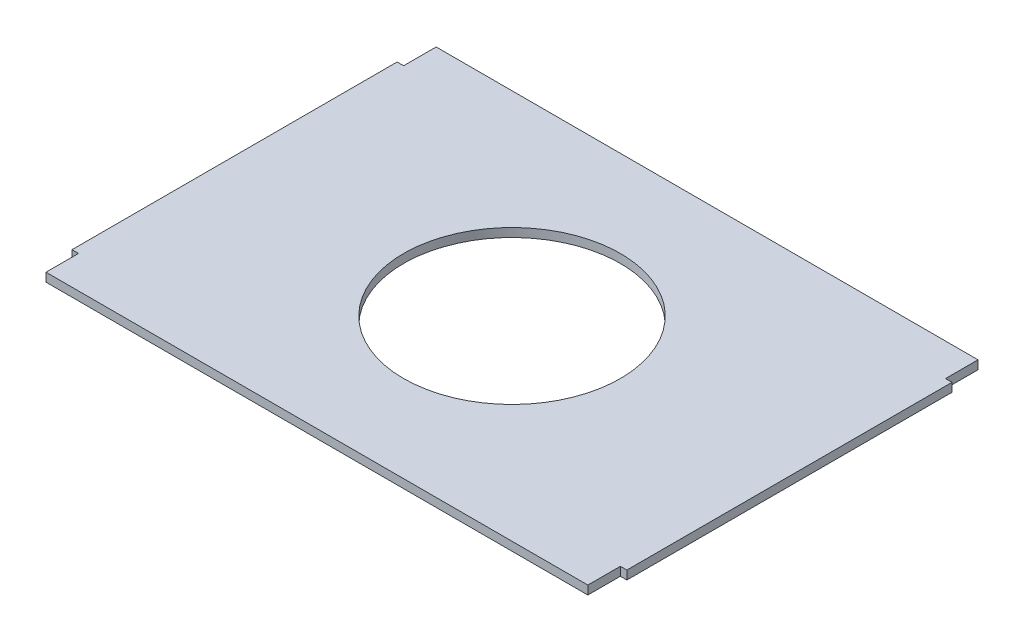
ISO-10303-21;
HEADER;
FILE_DESCRIPTION(('STEP AP214'),'2;1');
FILE_NAME('part.step','',(''),(''),'','','');
FILE_SCHEMA(('AUTOMOTIVE_DESIGN { 1 0 10303 214 1 1 1 1 }'));
ENDSEC;
DATA;
#1=APPLICATION_CONTEXT('core data for automotive mechanical design processes');
#2=APPLICATION_PROTOCOL_DEFINITION('international standard','automotive_design',2000,#1);
#3=PRODUCT_CONTEXT('',#1,'mechanical');
#4=PRODUCT('Part','Part','',(#3));
#5=PRODUCT_RELATED_PRODUCT_CATEGORY('part','',(#4));
#6=PRODUCT_DEFINITION_FORMATION('','',#4);
#7=PRODUCT_DEFINITION_CONTEXT('part definition',#1,'design');
#8=PRODUCT_DEFINITION('design','',#6,#7);
#9=PRODUCT_DEFINITION_SHAPE('','',#8);
#10=(LENGTH_UNIT() NAMED_UNIT(*) SI_UNIT(.MILLI.,.METRE.));
#11=(NAMED_UNIT(*) PLANE_ANGLE_UNIT() SI_UNIT($,.RADIAN.));
#12=(NAMED_UNIT(*) SI_UNIT($,.STERADIAN.) SOLID_ANGLE_UNIT());
#13=UNCERTAINTY_MEASURE_WITH_UNIT(LENGTH_MEASURE(1.E-05),#10,'distance_accuracy_value','');
#14=(GEOMETRIC_REPRESENTATION_CONTEXT(3) GLOBAL_UNCERTAINTY_ASSIGNED_CONTEXT((#13)) GLOBAL_UNIT_ASSIGNED_CONTEXT((#10,
#11,#12)) REPRESENTATION_CONTEXT('',''));
#15=CARTESIAN_POINT('',(0.,0.,0.));
#16=DIRECTION('',(0.,0.,1.));
#17=DIRECTION('',(1.,0.,0.));
#18=AXIS2_PLACEMENT_3D('',#15,#16,#17);
#19=CARTESIAN_POINT('',(0.,4.,0.));
#20=DIRECTION('',(0.,-1.,0.));
#21=DIRECTION('',(0.,0.,-1.));
#22=AXIS2_PLACEMENT_3D('',#19,#20,#21);
#23=PLANE('',#22);
#24=DIRECTION('',(0.,0.,-1.));
#25=VECTOR('',#24,1.);
#26=CARTESIAN_POINT('',(125.,4.,-75.));
#27=LINE('',#26,#25);
#28=CARTESIAN_POINT('',(125.,4.,-75.));
#29=VERTEX_POINT('',#28);
#30=CARTESIAN_POINT('',(125.,4.,-90.));
#31=VERTEX_POINT('',#30);
#32=EDGE_CURVE('E179',#29,#31,#27,.T.);
#33=ORIENTED_EDGE('',*,*,#32,.T.);
#34=DIRECTION('',(-1.,0.,0.));
#35=VECTOR('',#34,1.);
#36=CARTESIAN_POINT('',(-125.,4.,-90.));
#37=LINE('',#36,#35);
#38=CARTESIAN_POINT('',(-125.,4.,-90.));
#39=VERTEX_POINT('',#38);
#40=EDGE_CURVE('E107',#31,#39,#37,.T.);
#41=ORIENTED_EDGE('',*,*,#40,.T.);
#42=DIRECTION('',(0.,0.,1.));
#43=VECTOR('',#42,1.);
#44=CARTESIAN_POINT('',(-125.,4.,-75.));
#45=LINE('',#44,#43);
#46=CARTESIAN_POINT('',(-125.,4.,-75.));
#47=VERTEX_POINT('',#46);
#48=EDGE_CURVE('E206',#39,#47,#45,.T.);
#49=ORIENTED_EDGE('',*,*,#48,.T.);
#50=DIRECTION('',(-1.,0.,0.));
#51=VECTOR('',#50,1.);
#52=CARTESIAN_POINT('',(-128.,4.,-75.));
#53=LINE('',#52,#51);
#54=CARTESIAN_POINT('',(-128.,4.,-75.));
#55=VERTEX_POINT('',#54);
#56=EDGE_CURVE('E225',#47,#55,#53,.T.);
#57=ORIENTED_EDGE('',*,*,#56,.T.);
#58=DIRECTION('',(0.,0.,1.));
#59=VECTOR('',#58,1.);
#60=CARTESIAN_POINT('',(-128.,4.,75.));
#61=LINE('',#60,#59);
#62=CARTESIAN_POINT('',(-128.,4.,75.));
#63=VERTEX_POINT('',#62);
#64=EDGE_CURVE('E222',#55,#63,#61,.T.);
#65=ORIENTED_EDGE('',*,*,#64,.T.);
#66=DIRECTION('',(1.,0.,0.));
#67=VECTOR('',#66,1.);
#68=CARTESIAN_POINT('',(-128.,4.,75.));
#69=LINE('',#68,#67);
#70=CARTESIAN_POINT('',(-125.,4.,75.));
#71=VERTEX_POINT('',#70);
#72=EDGE_CURVE('E224',#63,#71,#69,.T.);
#73=ORIENTED_EDGE('',*,*,#72,.T.);
#74=DIRECTION('',(0.,0.,1.));
#75=VECTOR('',#74,1.);
#76=CARTESIAN_POINT('',(-125.,4.,90.));
#77=LINE('',#76,#75);
#78=CARTESIAN_POINT('',(-125.,4.,90.));
#79=VERTEX_POINT('',#78);
#80=EDGE_CURVE('E227',#71,#79,#77,.T.);
#81=ORIENTED_EDGE('',*,*,#80,.T.);
#82=DIRECTION('',(1.,0.,0.));
#83=VECTOR('',#82,1.);
#84=CARTESIAN_POINT('',(-125.,4.,90.));
#85=LINE('',#84,#83);
#86=CARTESIAN_POINT('',(125.,4.,90.));
#87=VERTEX_POINT('',#86);
#88=EDGE_CURVE('E233',#79,#87,#85,.T.);
#89=ORIENTED_EDGE('',*,*,#88,.T.);
#90=DIRECTION('',(0.,0.,-1.));
#91=VECTOR('',#90,1.);
#92=CARTESIAN_POINT('',(125.,4.,90.));
#93=LINE('',#92,#91);
#94=CARTESIAN_POINT('',(125.,4.,75.));
#95=VERTEX_POINT('',#94);
#96=EDGE_CURVE('E138',#87,#95,#93,.T.);
#97=ORIENTED_EDGE('',*,*,#96,.T.);
#98=DIRECTION('',(1.,0.,0.));
#99=VECTOR('',#98,1.);
#100=CARTESIAN_POINT('',(125.,4.,75.));
#101=LINE('',#100,#99);
#102=CARTESIAN_POINT('',(128.,4.,75.));
#103=VERTEX_POINT('',#102);
#104=EDGE_CURVE('E132',#95,#103,#101,.T.);
#105=ORIENTED_EDGE('',*,*,#104,.T.);
#106=DIRECTION('',(0.,0.,-1.));
#107=VECTOR('',#106,1.);
#108=CARTESIAN_POINT('',(128.,4.,75.));
#109=LINE('',#108,#107);
#110=CARTESIAN_POINT('',(128.,4.,-75.));
#111=VERTEX_POINT('',#110);
#112=EDGE_CURVE('E136',#103,#111,#109,.T.);
#113=ORIENTED_EDGE('',*,*,#112,.T.);
#114=DIRECTION('',(-1.,0.,0.));
#115=VECTOR('',#114,1.);
#116=CARTESIAN_POINT('',(125.,4.,-75.));
#117=LINE('',#116,#115);
#118=EDGE_CURVE('E52',#111,#29,#117,.T.);
#119=ORIENTED_EDGE('',*,*,#118,.T.);
#120=EDGE_LOOP('',(#33,#41,#49,#57,#65,#73,#81,#89,#97,#105,#113,#119));
#121=FACE_BOUND('',#120,.T.);
#122=CARTESIAN_POINT('',(0.,4.,0.));
#123=DIRECTION('',(0.,1.,0.));
#124=DIRECTION('',(0.,0.,1.));
#125=AXIS2_PLACEMENT_3D('',#122,#123,#124);
#126=CIRCLE('',#125,50.);
#127=CARTESIAN_POINT('',(0.,4.,50.));
#128=VERTEX_POINT('',#127);
#129=EDGE_CURVE('E160',#128,#128,#126,.T.);
#130=ORIENTED_EDGE('',*,*,#129,.F.);
#131=EDGE_LOOP('',(#130));
#132=FACE_BOUND('',#131,.T.);
#133=ADVANCED_FACE('F35',(#121,#132),#23,.F.);
#134=CARTESIAN_POINT('',(0.,0.,0.));
#135=DIRECTION('',(0.,-1.,0.));
#136=DIRECTION('',(0.,0.,-1.));
#137=AXIS2_PLACEMENT_3D('',#134,#135,#136);
#138=PLANE('',#137);
#139=DIRECTION('',(0.,0.,-1.));
#140=VECTOR('',#139,1.);
#141=CARTESIAN_POINT('',(125.,0.,-75.));
#142=LINE('',#141,#140);
#143=CARTESIAN_POINT('',(125.,0.,-75.));
#144=VERTEX_POINT('',#143);
#145=CARTESIAN_POINT('',(125.,0.,-90.));
#146=VERTEX_POINT('',#145);
#147=EDGE_CURVE('E156',#144,#146,#142,.T.);
#148=ORIENTED_EDGE('',*,*,#147,.F.);
#149=DIRECTION('',(-1.,0.,0.));
#150=VECTOR('',#149,1.);
#151=CARTESIAN_POINT('',(125.,0.,-75.));
#152=LINE('',#151,#150);
#153=CARTESIAN_POINT('',(128.,0.,-75.));
#154=VERTEX_POINT('',#153);
#155=EDGE_CURVE('E99',#154,#144,#152,.T.);
#156=ORIENTED_EDGE('',*,*,#155,.F.);
#157=DIRECTION('',(0.,0.,-1.));
#158=VECTOR('',#157,1.);
#159=CARTESIAN_POINT('',(128.,0.,75.));
#160=LINE('',#159,#158);
#161=CARTESIAN_POINT('',(128.,0.,75.));
#162=VERTEX_POINT('',#161);
#163=EDGE_CURVE('E93',#162,#154,#160,.T.);
#164=ORIENTED_EDGE('',*,*,#163,.F.);
#165=DIRECTION('',(1.,0.,0.));
#166=VECTOR('',#165,1.);
#167=CARTESIAN_POINT('',(125.,0.,75.));
#168=LINE('',#167,#166);
#169=CARTESIAN_POINT('',(125.,0.,75.));
#170=VERTEX_POINT('',#169);
#171=EDGE_CURVE('E146',#170,#162,#168,.T.);
#172=ORIENTED_EDGE('',*,*,#171,.F.);
#173=DIRECTION('',(0.,0.,-1.));
#174=VECTOR('',#173,1.);
#175=CARTESIAN_POINT('',(125.,0.,90.));
#176=LINE('',#175,#174);
#177=CARTESIAN_POINT('',(125.,0.,90.));
#178=VERTEX_POINT('',#177);
#179=EDGE_CURVE('E174',#178,#170,#176,.T.);
#180=ORIENTED_EDGE('',*,*,#179,.F.);
#181=DIRECTION('',(1.,0.,0.));
#182=VECTOR('',#181,1.);
#183=CARTESIAN_POINT('',(-125.,0.,90.));
#184=LINE('',#183,#182);
#185=CARTESIAN_POINT('',(-125.,0.,90.));
#186=VERTEX_POINT('',#185);
#187=EDGE_CURVE('E172',#186,#178,#184,.T.);
#188=ORIENTED_EDGE('',*,*,#187,.F.);
#189=DIRECTION('',(0.,0.,1.));
#190=VECTOR('',#189,1.);
#191=CARTESIAN_POINT('',(-125.,0.,90.));
#192=LINE('',#191,#190);
#193=CARTESIAN_POINT('',(-125.,0.,75.));
#194=VERTEX_POINT('',#193);
#195=EDGE_CURVE('E170',#194,#186,#192,.T.);
#196=ORIENTED_EDGE('',*,*,#195,.F.);
#197=DIRECTION('',(1.,0.,0.));
#198=VECTOR('',#197,1.);
#199=CARTESIAN_POINT('',(-128.,0.,75.));
#200=LINE('',#199,#198);
#201=CARTESIAN_POINT('',(-128.,0.,75.));
#202=VERTEX_POINT('',#201);
#203=EDGE_CURVE('E168',#202,#194,#200,.T.);
#204=ORIENTED_EDGE('',*,*,#203,.F.);
#205=DIRECTION('',(0.,0.,1.));
#206=VECTOR('',#205,1.);
#207=CARTESIAN_POINT('',(-128.,0.,75.));
#208=LINE('',#207,#206);
#209=CARTESIAN_POINT('',(-128.,0.,-75.));
#210=VERTEX_POINT('',#209);
#211=EDGE_CURVE('E166',#210,#202,#208,.T.);
#212=ORIENTED_EDGE('',*,*,#211,.F.);
#213=DIRECTION('',(-1.,0.,0.));
#214=VECTOR('',#213,1.);
#215=CARTESIAN_POINT('',(-128.,0.,-75.));
#216=LINE('',#215,#214);
#217=CARTESIAN_POINT('',(-125.,0.,-75.));
#218=VERTEX_POINT('',#217);
#219=EDGE_CURVE('E164',#218,#210,#216,.T.);
#220=ORIENTED_EDGE('',*,*,#219,.F.);
#221=DIRECTION('',(0.,0.,1.));
#222=VECTOR('',#221,1.);
#223=CARTESIAN_POINT('',(-125.,0.,-75.));
#224=LINE('',#223,#222);
#225=CARTESIAN_POINT('',(-125.,0.,-90.));
#226=VERTEX_POINT('',#225);
#227=EDGE_CURVE('E162',#226,#218,#224,.T.);
#228=ORIENTED_EDGE('',*,*,#227,.F.);
#229=DIRECTION('',(-1.,0.,0.));
#230=VECTOR('',#229,1.);
#231=CARTESIAN_POINT('',(-125.,0.,-90.));
#232=LINE('',#231,#230);
#233=EDGE_CURVE('E159',#146,#226,#232,.T.);
#234=ORIENTED_EDGE('',*,*,#233,.F.);
#235=EDGE_LOOP('',(#148,#156,#164,#172,#180,#188,#196,#204,#212,#220,#228,#234));
#236=FACE_BOUND('',#235,.T.);
#237=CARTESIAN_POINT('',(0.,0.,0.));
#238=DIRECTION('',(0.,1.,0.));
#239=DIRECTION('',(0.,0.,1.));
#240=AXIS2_PLACEMENT_3D('',#237,#238,#239);
#241=CIRCLE('',#240,50.);
#242=CARTESIAN_POINT('',(0.,0.,50.));
#243=VERTEX_POINT('',#242);
#244=EDGE_CURVE('E380',#243,#243,#241,.T.);
#245=ORIENTED_EDGE('',*,*,#244,.T.);
#246=EDGE_LOOP('',(#245));
#247=FACE_BOUND('',#246,.T.);
#248=ADVANCED_FACE('F210',(#236,#247),#138,.T.);
#249=CARTESIAN_POINT('',(125.,4.,-75.));
#250=DIRECTION('',(-1.,0.,0.));
#251=DIRECTION('',(0.,0.,1.));
#252=AXIS2_PLACEMENT_3D('',#249,#250,#251);
#253=PLANE('',#252);
#254=ORIENTED_EDGE('',*,*,#147,.T.);
#255=DIRECTION('',(0.,-1.,0.));
#256=VECTOR('',#255,1.);
#257=CARTESIAN_POINT('',(125.,4.,-90.));
#258=LINE('',#257,#256);
#259=EDGE_CURVE('E11',#31,#146,#258,.T.);
#260=ORIENTED_EDGE('',*,*,#259,.F.);
#261=ORIENTED_EDGE('',*,*,#32,.F.);
#262=DIRECTION('',(0.,-1.,0.));
#263=VECTOR('',#262,1.);
#264=CARTESIAN_POINT('',(125.,4.,-75.));
#265=LINE('',#264,#263);
#266=EDGE_CURVE('E152',#29,#144,#265,.T.);
#267=ORIENTED_EDGE('',*,*,#266,.T.);
#268=EDGE_LOOP('',(#254,#260,#261,#267));
#269=FACE_BOUND('',#268,.T.);
#270=ADVANCED_FACE('F37',(#269),#253,.F.);
#271=CARTESIAN_POINT('',(-125.,4.,-90.));
#272=DIRECTION('',(0.,0.,1.));
#273=DIRECTION('',(1.,0.,0.));
#274=AXIS2_PLACEMENT_3D('',#271,#272,#273);
#275=PLANE('',#274);
#276=ORIENTED_EDGE('',*,*,#233,.T.);
#277=DIRECTION('',(0.,-1.,0.));
#278=VECTOR('',#277,1.);
#279=CARTESIAN_POINT('',(-125.,4.,-90.));
#280=LINE('',#279,#278);
#281=EDGE_CURVE('E44',#39,#226,#280,.T.);
#282=ORIENTED_EDGE('',*,*,#281,.F.);
#283=ORIENTED_EDGE('',*,*,#40,.F.);
#284=ORIENTED_EDGE('',*,*,#259,.T.);
#285=EDGE_LOOP('',(#276,#282,#283,#284));
#286=FACE_BOUND('',#285,.T.);
#287=ADVANCED_FACE('F267',(#286),#275,.F.);
#288=CARTESIAN_POINT('',(-125.,4.,-75.));
#289=DIRECTION('',(1.,0.,0.));
#290=DIRECTION('',(0.,0.,-1.));
#291=AXIS2_PLACEMENT_3D('',#288,#289,#290);
#292=PLANE('',#291);
#293=ORIENTED_EDGE('',*,*,#227,.T.);
#294=DIRECTION('',(0.,-1.,0.));
#295=VECTOR('',#294,1.);
#296=CARTESIAN_POINT('',(-125.,4.,-75.));
#297=LINE('',#296,#295);
#298=EDGE_CURVE('E198',#47,#218,#297,.T.);
#299=ORIENTED_EDGE('',*,*,#298,.F.);
#300=ORIENTED_EDGE('',*,*,#48,.F.);
#301=ORIENTED_EDGE('',*,*,#281,.T.);
#302=EDGE_LOOP('',(#293,#299,#300,#301));
#303=FACE_BOUND('',#302,.T.);
#304=ADVANCED_FACE('F204',(#303),#292,.F.);
#305=CARTESIAN_POINT('',(-128.,4.,-75.));
#306=DIRECTION('',(0.,0.,1.));
#307=DIRECTION('',(1.,0.,0.));
#308=AXIS2_PLACEMENT_3D('',#305,#306,#307);
#309=PLANE('',#308);
#310=ORIENTED_EDGE('',*,*,#219,.T.);
#311=DIRECTION('',(0.,-1.,0.));
#312=VECTOR('',#311,1.);
#313=CARTESIAN_POINT('',(-128.,4.,-75.));
#314=LINE('',#313,#312);
#315=EDGE_CURVE('E195',#55,#210,#314,.T.);
#316=ORIENTED_EDGE('',*,*,#315,.F.);
#317=ORIENTED_EDGE('',*,*,#56,.F.);
#318=ORIENTED_EDGE('',*,*,#298,.T.);
#319=EDGE_LOOP('',(#310,#316,#317,#318));
#320=FACE_BOUND('',#319,.T.);
#321=ADVANCED_FACE('F216',(#320),#309,.F.);
#322=CARTESIAN_POINT('',(-128.,4.,75.));
#323=DIRECTION('',(1.,0.,0.));
#324=DIRECTION('',(0.,0.,-1.));
#325=AXIS2_PLACEMENT_3D('',#322,#323,#324);
#326=PLANE('',#325);
#327=ORIENTED_EDGE('',*,*,#211,.T.);
#328=DIRECTION('',(0.,-1.,0.));
#329=VECTOR('',#328,1.);
#330=CARTESIAN_POINT('',(-128.,4.,75.));
#331=LINE('',#330,#329);
#332=EDGE_CURVE('E192',#63,#202,#331,.T.);
#333=ORIENTED_EDGE('',*,*,#332,.F.);
#334=ORIENTED_EDGE('',*,*,#64,.F.);
#335=ORIENTED_EDGE('',*,*,#315,.T.);
#336=EDGE_LOOP('',(#327,#333,#334,#335));
#337=FACE_BOUND('',#336,.T.);
#338=ADVANCED_FACE('F220',(#337),#326,.F.);
#339=CARTESIAN_POINT('',(-128.,4.,75.));
#340=DIRECTION('',(0.,0.,-1.));
#341=DIRECTION('',(-1.,0.,0.));
#342=AXIS2_PLACEMENT_3D('',#339,#340,#341);
#343=PLANE('',#342);
#344=ORIENTED_EDGE('',*,*,#203,.T.);
#345=DIRECTION('',(0.,-1.,0.));
#346=VECTOR('',#345,1.);
#347=CARTESIAN_POINT('',(-125.,4.,75.));
#348=LINE('',#347,#346);
#349=EDGE_CURVE('E189',#71,#194,#348,.T.);
#350=ORIENTED_EDGE('',*,*,#349,.F.);
#351=ORIENTED_EDGE('',*,*,#72,.F.);
#352=ORIENTED_EDGE('',*,*,#332,.T.);
#353=EDGE_LOOP('',(#344,#350,#351,#352));
#354=FACE_BOUND('',#353,.T.);
#355=ADVANCED_FACE('F280',(#354),#343,.F.);
#356=CARTESIAN_POINT('',(-125.,4.,90.));
#357=DIRECTION('',(1.,0.,0.));
#358=DIRECTION('',(0.,0.,-1.));
#359=AXIS2_PLACEMENT_3D('',#356,#357,#358);
#360=PLANE('',#359);
#361=ORIENTED_EDGE('',*,*,#195,.T.);
#362=DIRECTION('',(0.,-1.,0.));
#363=VECTOR('',#362,1.);
#364=CARTESIAN_POINT('',(-125.,4.,90.));
#365=LINE('',#364,#363);
#366=EDGE_CURVE('E186',#79,#186,#365,.T.);
#367=ORIENTED_EDGE('',*,*,#366,.F.);
#368=ORIENTED_EDGE('',*,*,#80,.F.);
#369=ORIENTED_EDGE('',*,*,#349,.T.);
#370=EDGE_LOOP('',(#361,#367,#368,#369));
#371=FACE_BOUND('',#370,.T.);
#372=ADVANCED_FACE('F283',(#371),#360,.F.);
#373=CARTESIAN_POINT('',(-125.,4.,90.));
#374=DIRECTION('',(0.,0.,-1.));
#375=DIRECTION('',(-1.,0.,0.));
#376=AXIS2_PLACEMENT_3D('',#373,#374,#375);
#377=PLANE('',#376);
#378=ORIENTED_EDGE('',*,*,#187,.T.);
#379=DIRECTION('',(0.,-1.,0.));
#380=VECTOR('',#379,1.);
#381=CARTESIAN_POINT('',(125.,4.,90.));
#382=LINE('',#381,#380);
#383=EDGE_CURVE('E183',#87,#178,#382,.T.);
#384=ORIENTED_EDGE('',*,*,#383,.F.);
#385=ORIENTED_EDGE('',*,*,#88,.F.);
#386=ORIENTED_EDGE('',*,*,#366,.T.);
#387=EDGE_LOOP('',(#378,#384,#385,#386));
#388=FACE_BOUND('',#387,.T.);
#389=ADVANCED_FACE('F239',(#388),#377,.F.);
#390=CARTESIAN_POINT('',(125.,4.,90.));
#391=DIRECTION('',(-1.,0.,0.));
#392=DIRECTION('',(0.,0.,1.));
#393=AXIS2_PLACEMENT_3D('',#390,#391,#392);
#394=PLANE('',#393);
#395=ORIENTED_EDGE('',*,*,#179,.T.);
#396=DIRECTION('',(0.,-1.,0.));
#397=VECTOR('',#396,1.);
#398=CARTESIAN_POINT('',(125.,4.,75.));
#399=LINE('',#398,#397);
#400=EDGE_CURVE('E147',#95,#170,#399,.T.);
#401=ORIENTED_EDGE('',*,*,#400,.F.);
#402=ORIENTED_EDGE('',*,*,#96,.F.);
#403=ORIENTED_EDGE('',*,*,#383,.T.);
#404=EDGE_LOOP('',(#395,#401,#402,#403));
#405=FACE_BOUND('',#404,.T.);
#406=ADVANCED_FACE('F243',(#405),#394,.F.);
#407=CARTESIAN_POINT('',(125.,4.,75.));
#408=DIRECTION('',(0.,0.,-1.));
#409=DIRECTION('',(-1.,0.,0.));
#410=AXIS2_PLACEMENT_3D('',#407,#408,#409);
#411=PLANE('',#410);
#412=ORIENTED_EDGE('',*,*,#171,.T.);
#413=DIRECTION('',(0.,-1.,0.));
#414=VECTOR('',#413,1.);
#415=CARTESIAN_POINT('',(128.,4.,75.));
#416=LINE('',#415,#414);
#417=EDGE_CURVE('E143',#103,#162,#416,.T.);
#418=ORIENTED_EDGE('',*,*,#417,.F.);
#419=ORIENTED_EDGE('',*,*,#104,.F.);
#420=ORIENTED_EDGE('',*,*,#400,.T.);
#421=EDGE_LOOP('',(#412,#418,#419,#420));
#422=FACE_BOUND('',#421,.T.);
#423=ADVANCED_FACE('F144',(#422),#411,.F.);
#424=CARTESIAN_POINT('',(128.,4.,75.));
#425=DIRECTION('',(-1.,0.,0.));
#426=DIRECTION('',(0.,0.,1.));
#427=AXIS2_PLACEMENT_3D('',#424,#425,#426);
#428=PLANE('',#427);
#429=ORIENTED_EDGE('',*,*,#163,.T.);
#430=DIRECTION('',(0.,-1.,0.));
#431=VECTOR('',#430,1.);
#432=CARTESIAN_POINT('',(128.,4.,-75.));
#433=LINE('',#432,#431);
#434=EDGE_CURVE('E148',#111,#154,#433,.T.);
#435=ORIENTED_EDGE('',*,*,#434,.F.);
#436=ORIENTED_EDGE('',*,*,#112,.F.);
#437=ORIENTED_EDGE('',*,*,#417,.T.);
#438=EDGE_LOOP('',(#429,#435,#436,#437));
#439=FACE_BOUND('',#438,.T.);
#440=ADVANCED_FACE('F150',(#439),#428,.F.);
#441=CARTESIAN_POINT('',(125.,4.,-75.));
#442=DIRECTION('',(0.,0.,1.));
#443=DIRECTION('',(1.,0.,0.));
#444=AXIS2_PLACEMENT_3D('',#441,#442,#443);
#445=PLANE('',#444);
#446=ORIENTED_EDGE('',*,*,#155,.T.);
#447=ORIENTED_EDGE('',*,*,#266,.F.);
#448=ORIENTED_EDGE('',*,*,#118,.F.);
#449=ORIENTED_EDGE('',*,*,#434,.T.);
#450=EDGE_LOOP('',(#446,#447,#448,#449));
#451=FACE_BOUND('',#450,.T.);
#452=ADVANCED_FACE('F247',(#451),#445,.F.);
#453=CARTESIAN_POINT('',(0.,4.,0.));
#454=DIRECTION('',(0.,-1.,0.));
#455=DIRECTION('',(0.,0.,-1.));
#456=AXIS2_PLACEMENT_3D('',#453,#454,#455);
#457=CYLINDRICAL_SURFACE('',#456,50.);
#458=ORIENTED_EDGE('',*,*,#129,.T.);
#459=EDGE_LOOP('',(#458));
#460=FACE_BOUND('',#459,.T.);
#461=ORIENTED_EDGE('',*,*,#244,.F.);
#462=EDGE_LOOP('',(#461));
#463=FACE_BOUND('',#462,.T.);
#464=ADVANCED_FACE('F249',(#460,#463),#457,.F.);
#465=CLOSED_SHELL('',(#133,#248,#270,#287,#304,#321,#338,#355,#372,#389,#406,#423,#440,#452,#464));
#466=MANIFOLD_SOLID_BREP('B2',#465);
#467=ADVANCED_BREP_SHAPE_REPRESENTATION('',(#18,#466),#14);
#468=SHAPE_DEFINITION_REPRESENTATION(#9,#467);
ENDSEC;
END-ISO-10303-21;
